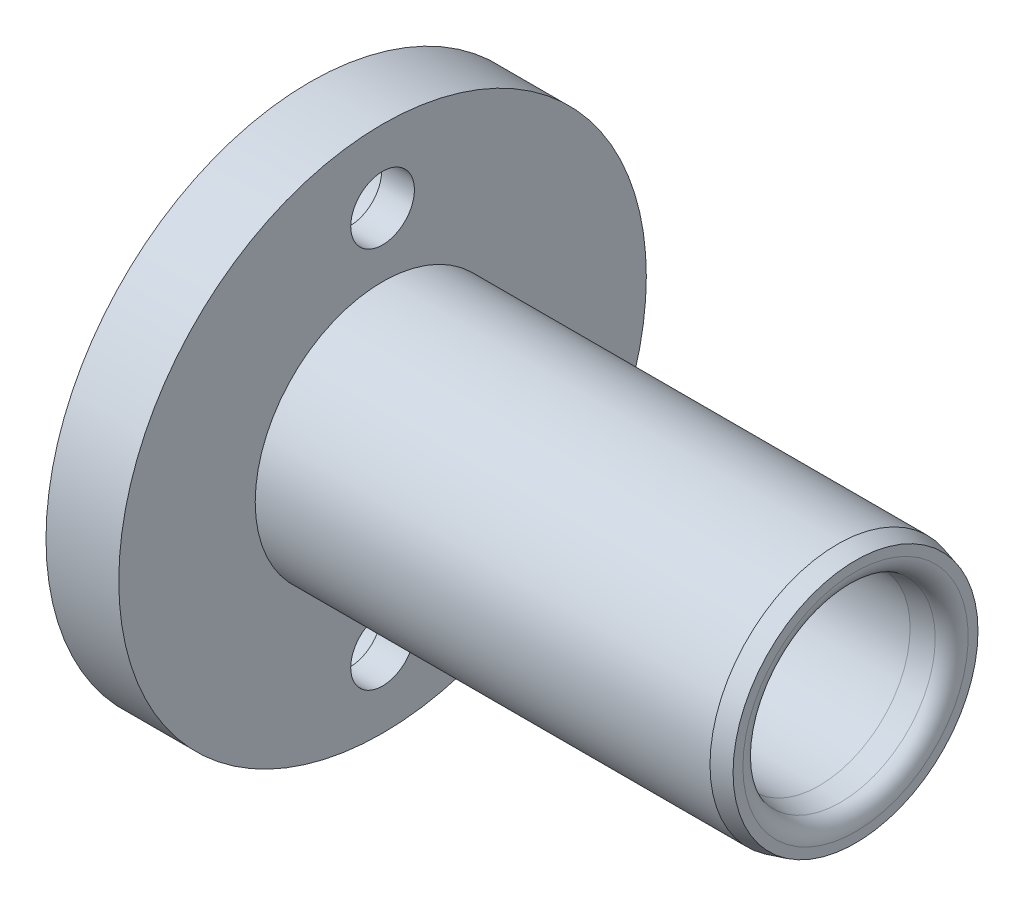
ISO-10303-21;
HEADER;
FILE_DESCRIPTION(('STEP AP214'),'2;1');
FILE_NAME('part.step','',(''),(''),'','','');
FILE_SCHEMA(('AUTOMOTIVE_DESIGN { 1 0 10303 214 1 1 1 1 }'));
ENDSEC;
DATA;
#1=APPLICATION_CONTEXT('core data for automotive mechanical design processes');
#2=APPLICATION_PROTOCOL_DEFINITION('international standard','automotive_design',2000,#1);
#3=PRODUCT_CONTEXT('',#1,'mechanical');
#4=PRODUCT('Part','Part','',(#3));
#5=PRODUCT_RELATED_PRODUCT_CATEGORY('part','',(#4));
#6=PRODUCT_DEFINITION_FORMATION('','',#4);
#7=PRODUCT_DEFINITION_CONTEXT('part definition',#1,'design');
#8=PRODUCT_DEFINITION('design','',#6,#7);
#9=PRODUCT_DEFINITION_SHAPE('','',#8);
#10=(LENGTH_UNIT() NAMED_UNIT(*) SI_UNIT(.MILLI.,.METRE.));
#11=(NAMED_UNIT(*) PLANE_ANGLE_UNIT() SI_UNIT($,.RADIAN.));
#12=(NAMED_UNIT(*) SI_UNIT($,.STERADIAN.) SOLID_ANGLE_UNIT());
#13=UNCERTAINTY_MEASURE_WITH_UNIT(LENGTH_MEASURE(1.E-05),#10,'distance_accuracy_value','');
#14=(GEOMETRIC_REPRESENTATION_CONTEXT(3) GLOBAL_UNCERTAINTY_ASSIGNED_CONTEXT((#13)) GLOBAL_UNIT_ASSIGNED_CONTEXT((#10,
#11,#12)) REPRESENTATION_CONTEXT('',''));
#15=CARTESIAN_POINT('',(0.,0.,0.));
#16=DIRECTION('',(0.,0.,1.));
#17=DIRECTION('',(1.,0.,0.));
#18=AXIS2_PLACEMENT_3D('',#15,#16,#17);
#19=CARTESIAN_POINT('',(26.,5.,0.));
#20=DIRECTION('',(-1.,0.,0.));
#21=DIRECTION('',(0.,0.,1.));
#22=AXIS2_PLACEMENT_3D('',#19,#20,#21);
#23=PLANE('',#22);
#24=CARTESIAN_POINT('',(26.,0.,0.));
#25=DIRECTION('',(-1.,0.,0.));
#26=DIRECTION('',(0.,0.,1.));
#27=AXIS2_PLACEMENT_3D('',#24,#25,#26);
#28=CIRCLE('',#27,6.19175359259422);
#29=CARTESIAN_POINT('',(26.,0.,6.19175359259422));
#30=VERTEX_POINT('',#29);
#31=EDGE_CURVE('E94',#30,#30,#28,.T.);
#32=ORIENTED_EDGE('',*,*,#31,.T.);
#33=EDGE_LOOP('',(#32));
#34=FACE_BOUND('',#33,.T.);
#35=CARTESIAN_POINT('',(26.,0.,0.));
#36=DIRECTION('',(-1.,0.,0.));
#37=DIRECTION('',(0.,0.,1.));
#38=AXIS2_PLACEMENT_3D('',#35,#36,#37);
#39=CIRCLE('',#38,6.73205080756888);
#40=CARTESIAN_POINT('',(26.,0.,6.73205080756888));
#41=VERTEX_POINT('',#40);
#42=EDGE_CURVE('E83',#41,#41,#39,.F.);
#43=ORIENTED_EDGE('',*,*,#42,.T.);
#44=EDGE_LOOP('',(#43));
#45=FACE_BOUND('',#44,.T.);
#46=ADVANCED_FACE('F39',(#34,#45),#23,.F.);
#47=CARTESIAN_POINT('',(0.,0.,0.));
#48=DIRECTION('',(-1.,0.,0.));
#49=DIRECTION('',(0.,0.,1.));
#50=AXIS2_PLACEMENT_3D('',#47,#48,#49);
#51=CYLINDRICAL_SURFACE('',#50,5.);
#52=CARTESIAN_POINT('',(-0.999999999999938,0.,0.));
#53=DIRECTION('',(1.,0.,0.));
#54=DIRECTION('',(0.,0.,-1.));
#55=AXIS2_PLACEMENT_3D('',#52,#53,#54);
#56=CIRCLE('',#55,5.);
#57=CARTESIAN_POINT('',(-0.999999999999938,0.,-5.));
#58=VERTEX_POINT('',#57);
#59=EDGE_CURVE('E91',#58,#58,#56,.F.);
#60=ORIENTED_EDGE('',*,*,#59,.T.);
#61=EDGE_LOOP('',(#60));
#62=FACE_BOUND('',#61,.T.);
#63=CARTESIAN_POINT('',(23.9999999999999,0.,0.));
#64=DIRECTION('',(-1.,0.,0.));
#65=DIRECTION('',(0.,0.,1.));
#66=AXIS2_PLACEMENT_3D('',#63,#64,#65);
#67=CIRCLE('',#66,5.);
#68=CARTESIAN_POINT('',(23.9999999999999,0.,5.));
#69=VERTEX_POINT('',#68);
#70=EDGE_CURVE('E87',#69,#69,#67,.F.);
#71=ORIENTED_EDGE('',*,*,#70,.T.);
#72=EDGE_LOOP('',(#71));
#73=FACE_BOUND('',#72,.T.);
#74=ADVANCED_FACE('F112',(#62,#73),#51,.F.);
#75=CARTESIAN_POINT('',(-4.,5.,0.));
#76=DIRECTION('',(1.,0.,0.));
#77=DIRECTION('',(0.,0.,-1.));
#78=AXIS2_PLACEMENT_3D('',#75,#76,#77);
#79=PLANE('',#78);
#80=CARTESIAN_POINT('',(-4.,10.5,0.));
#81=DIRECTION('',(-1.,0.,0.));
#82=DIRECTION('',(0.,0.,1.));
#83=AXIS2_PLACEMENT_3D('',#80,#81,#82);
#84=CIRCLE('',#83,3.);
#85=CARTESIAN_POINT('',(-4.,10.5,3.));
#86=VERTEX_POINT('',#85);
#87=EDGE_CURVE('E287',#86,#86,#84,.T.);
#88=ORIENTED_EDGE('',*,*,#87,.F.);
#89=EDGE_LOOP('',(#88));
#90=FACE_BOUND('',#89,.T.);
#91=CARTESIAN_POINT('',(-4.,-10.5,0.));
#92=DIRECTION('',(-1.,0.,0.));
#93=DIRECTION('',(0.,0.,1.));
#94=AXIS2_PLACEMENT_3D('',#91,#92,#93);
#95=CIRCLE('',#94,3.);
#96=CARTESIAN_POINT('',(-4.,-10.5,3.));
#97=VERTEX_POINT('',#96);
#98=EDGE_CURVE('E70',#97,#97,#95,.T.);
#99=ORIENTED_EDGE('',*,*,#98,.F.);
#100=EDGE_LOOP('',(#99));
#101=FACE_BOUND('',#100,.T.);
#102=CARTESIAN_POINT('',(-4.,0.,0.));
#103=DIRECTION('',(1.,0.,0.));
#104=DIRECTION('',(0.,0.,-1.));
#105=AXIS2_PLACEMENT_3D('',#102,#103,#104);
#106=CIRCLE('',#105,6.36808057330268);
#107=CARTESIAN_POINT('',(-4.,0.,-6.36808057330268));
#108=VERTEX_POINT('',#107);
#109=EDGE_CURVE('E47',#108,#108,#106,.T.);
#110=ORIENTED_EDGE('',*,*,#109,.T.);
#111=EDGE_LOOP('',(#110));
#112=FACE_BOUND('',#111,.T.);
#113=CARTESIAN_POINT('',(-4.,0.,0.));
#114=DIRECTION('',(-1.,0.,0.));
#115=DIRECTION('',(0.,0.,1.));
#116=AXIS2_PLACEMENT_3D('',#113,#114,#115);
#117=CIRCLE('',#116,14.5);
#118=CARTESIAN_POINT('',(-4.,0.,14.5));
#119=VERTEX_POINT('',#118);
#120=EDGE_CURVE('E76',#119,#119,#117,.T.);
#121=ORIENTED_EDGE('',*,*,#120,.T.);
#122=EDGE_LOOP('',(#121));
#123=FACE_BOUND('',#122,.T.);
#124=ADVANCED_FACE('F136',(#90,#101,#112,#123),#79,.F.);
#125=CARTESIAN_POINT('',(0.,0.,0.));
#126=DIRECTION('',(-1.,0.,0.));
#127=DIRECTION('',(0.,0.,1.));
#128=AXIS2_PLACEMENT_3D('',#125,#126,#127);
#129=CYLINDRICAL_SURFACE('',#128,14.5);
#130=ORIENTED_EDGE('',*,*,#120,.F.);
#131=EDGE_LOOP('',(#130));
#132=FACE_BOUND('',#131,.T.);
#133=CARTESIAN_POINT('',(0.,0.,0.));
#134=DIRECTION('',(-1.,0.,0.));
#135=DIRECTION('',(0.,0.,1.));
#136=AXIS2_PLACEMENT_3D('',#133,#134,#135);
#137=CIRCLE('',#136,14.5);
#138=CARTESIAN_POINT('',(0.,0.,14.5));
#139=VERTEX_POINT('',#138);
#140=EDGE_CURVE('E62',#139,#139,#137,.T.);
#141=ORIENTED_EDGE('',*,*,#140,.T.);
#142=EDGE_LOOP('',(#141));
#143=FACE_BOUND('',#142,.T.);
#144=ADVANCED_FACE('F130',(#132,#143),#129,.T.);
#145=CARTESIAN_POINT('',(0.,7.,0.));
#146=DIRECTION('',(-1.,0.,0.));
#147=DIRECTION('',(0.,0.,1.));
#148=AXIS2_PLACEMENT_3D('',#145,#146,#147);
#149=PLANE('',#148);
#150=CARTESIAN_POINT('',(0.,10.5,0.));
#151=DIRECTION('',(-1.,0.,0.));
#152=DIRECTION('',(0.,0.,1.));
#153=AXIS2_PLACEMENT_3D('',#150,#151,#152);
#154=CIRCLE('',#153,1.75);
#155=CARTESIAN_POINT('',(0.,10.5,1.75));
#156=VERTEX_POINT('',#155);
#157=EDGE_CURVE('E43',#156,#156,#154,.T.);
#158=ORIENTED_EDGE('',*,*,#157,.T.);
#159=EDGE_LOOP('',(#158));
#160=FACE_BOUND('',#159,.T.);
#161=CARTESIAN_POINT('',(0.,-10.5,0.));
#162=DIRECTION('',(-1.,0.,0.));
#163=DIRECTION('',(0.,0.,1.));
#164=AXIS2_PLACEMENT_3D('',#161,#162,#163);
#165=CIRCLE('',#164,1.75);
#166=CARTESIAN_POINT('',(0.,-10.5,1.75));
#167=VERTEX_POINT('',#166);
#168=EDGE_CURVE('E55',#167,#167,#165,.T.);
#169=ORIENTED_EDGE('',*,*,#168,.T.);
#170=EDGE_LOOP('',(#169));
#171=FACE_BOUND('',#170,.T.);
#172=ORIENTED_EDGE('',*,*,#140,.F.);
#173=EDGE_LOOP('',(#172));
#174=FACE_BOUND('',#173,.T.);
#175=CARTESIAN_POINT('',(0.,0.,0.));
#176=DIRECTION('',(-1.,0.,0.));
#177=DIRECTION('',(0.,0.,1.));
#178=AXIS2_PLACEMENT_3D('',#175,#176,#177);
#179=CIRCLE('',#178,7.);
#180=CARTESIAN_POINT('',(0.,0.,7.));
#181=VERTEX_POINT('',#180);
#182=EDGE_CURVE('E57',#181,#181,#179,.T.);
#183=ORIENTED_EDGE('',*,*,#182,.T.);
#184=EDGE_LOOP('',(#183));
#185=FACE_BOUND('',#184,.T.);
#186=ADVANCED_FACE('F125',(#160,#171,#174,#185),#149,.F.);
#187=CARTESIAN_POINT('',(0.,0.,0.));
#188=DIRECTION('',(-1.,0.,0.));
#189=DIRECTION('',(0.,0.,1.));
#190=AXIS2_PLACEMENT_3D('',#187,#188,#189);
#191=CYLINDRICAL_SURFACE('',#190,7.);
#192=CARTESIAN_POINT('',(25.,0.,0.));
#193=DIRECTION('',(-1.,0.,0.));
#194=DIRECTION('',(0.,0.,1.));
#195=AXIS2_PLACEMENT_3D('',#192,#193,#194);
#196=CIRCLE('',#195,7.);
#197=CARTESIAN_POINT('',(25.,0.,7.));
#198=VERTEX_POINT('',#197);
#199=EDGE_CURVE('E79',#198,#198,#196,.T.);
#200=ORIENTED_EDGE('',*,*,#199,.T.);
#201=EDGE_LOOP('',(#200));
#202=FACE_BOUND('',#201,.T.);
#203=ORIENTED_EDGE('',*,*,#182,.F.);
#204=EDGE_LOOP('',(#203));
#205=FACE_BOUND('',#204,.T.);
#206=ADVANCED_FACE('F119',(#202,#205),#191,.T.);
#207=CARTESIAN_POINT('',(25.,0.,0.));
#208=DIRECTION('',(-1.,0.,0.));
#209=DIRECTION('',(0.,0.,1.));
#210=AXIS2_PLACEMENT_3D('',#207,#208,#209);
#211=CONICAL_SURFACE('',#210,7.,0.261799387799144);
#212=ORIENTED_EDGE('',*,*,#42,.F.);
#213=EDGE_LOOP('',(#212));
#214=FACE_BOUND('',#213,.T.);
#215=ORIENTED_EDGE('',*,*,#199,.F.);
#216=EDGE_LOOP('',(#215));
#217=FACE_BOUND('',#216,.T.);
#218=ADVANCED_FACE('F116',(#214,#217),#211,.T.);
#219=CARTESIAN_POINT('',(26.,0.,0.));
#220=DIRECTION('',(1.,0.,0.));
#221=DIRECTION('',(0.,0.,-1.));
#222=AXIS2_PLACEMENT_3D('',#219,#220,#221);
#223=CONICAL_SURFACE('',#222,5.35265396141693,0.17453292519943);
#224=CARTESIAN_POINT('',(25.1736481776669,0.,0.));
#225=DIRECTION('',(1.,0.,0.));
#226=DIRECTION('',(0.,0.,-1.));
#227=AXIS2_PLACEMENT_3D('',#224,#225,#226);
#228=CIRCLE('',#227,5.20694583958201);
#229=CARTESIAN_POINT('',(25.1736481776669,0.,-5.20694583958201));
#230=VERTEX_POINT('',#229);
#231=EDGE_CURVE('E52',#230,#230,#228,.T.);
#232=ORIENTED_EDGE('',*,*,#231,.T.);
#233=EDGE_LOOP('',(#232));
#234=FACE_BOUND('',#233,.T.);
#235=ORIENTED_EDGE('',*,*,#70,.F.);
#236=EDGE_LOOP('',(#235));
#237=FACE_BOUND('',#236,.T.);
#238=ADVANCED_FACE('F101',(#234,#237),#223,.F.);
#239=CARTESIAN_POINT('',(-0.999999999999938,0.,0.));
#240=DIRECTION('',(-1.,0.,0.));
#241=DIRECTION('',(0.,0.,1.));
#242=AXIS2_PLACEMENT_3D('',#239,#240,#241);
#243=CONICAL_SURFACE('',#242,5.,0.17453292519943);
#244=CARTESIAN_POINT('',(-3.17364817766693,0.,0.));
#245=DIRECTION('',(-1.,0.,0.));
#246=DIRECTION('',(0.,0.,1.));
#247=AXIS2_PLACEMENT_3D('',#244,#245,#246);
#248=CIRCLE('',#247,5.38327282029047);
#249=CARTESIAN_POINT('',(-3.17364817766693,0.,5.38327282029047));
#250=VERTEX_POINT('',#249);
#251=EDGE_CURVE('E10',#250,#250,#248,.T.);
#252=ORIENTED_EDGE('',*,*,#251,.T.);
#253=EDGE_LOOP('',(#252));
#254=FACE_BOUND('',#253,.T.);
#255=ORIENTED_EDGE('',*,*,#59,.F.);
#256=EDGE_LOOP('',(#255));
#257=FACE_BOUND('',#256,.T.);
#258=ADVANCED_FACE('F107',(#254,#257),#243,.F.);
#259=CARTESIAN_POINT('',(25.,0.,0.));
#260=DIRECTION('',(-1.,0.,0.));
#261=DIRECTION('',(0.,0.,1.));
#262=AXIS2_PLACEMENT_3D('',#259,#260,#261);
#263=TOROIDAL_SURFACE('',#262,6.19175359259422,1.);
#264=ORIENTED_EDGE('',*,*,#231,.F.);
#265=EDGE_LOOP('',(#264));
#266=FACE_BOUND('',#265,.T.);
#267=ORIENTED_EDGE('',*,*,#31,.F.);
#268=EDGE_LOOP('',(#267));
#269=FACE_BOUND('',#268,.T.);
#270=ADVANCED_FACE('F104',(#266,#269),#263,.T.);
#271=CARTESIAN_POINT('',(-3.,0.,0.));
#272=DIRECTION('',(1.,0.,0.));
#273=DIRECTION('',(0.,0.,-1.));
#274=AXIS2_PLACEMENT_3D('',#271,#272,#273);
#275=TOROIDAL_SURFACE('',#274,6.36808057330268,1.);
#276=ORIENTED_EDGE('',*,*,#251,.F.);
#277=EDGE_LOOP('',(#276));
#278=FACE_BOUND('',#277,.T.);
#279=ORIENTED_EDGE('',*,*,#109,.F.);
#280=EDGE_LOOP('',(#279));
#281=FACE_BOUND('',#280,.T.);
#282=ADVANCED_FACE('F41',(#278,#281),#275,.T.);
#283=CARTESIAN_POINT('',(-4.,-10.5,0.));
#284=DIRECTION('',(-1.,0.,0.));
#285=DIRECTION('',(0.,0.,1.));
#286=AXIS2_PLACEMENT_3D('',#283,#284,#285);
#287=CYLINDRICAL_SURFACE('',#286,1.75);
#288=CARTESIAN_POINT('',(-1.8,-10.5,0.));
#289=DIRECTION('',(-1.,0.,0.));
#290=DIRECTION('',(0.,0.,1.));
#291=AXIS2_PLACEMENT_3D('',#288,#289,#290);
#292=CIRCLE('',#291,1.75);
#293=CARTESIAN_POINT('',(-1.8,-10.5,1.75));
#294=VERTEX_POINT('',#293);
#295=EDGE_CURVE('E58',#294,#294,#292,.T.);
#296=ORIENTED_EDGE('',*,*,#295,.T.);
#297=EDGE_LOOP('',(#296));
#298=FACE_BOUND('',#297,.T.);
#299=ORIENTED_EDGE('',*,*,#168,.F.);
#300=EDGE_LOOP('',(#299));
#301=FACE_BOUND('',#300,.T.);
#302=ADVANCED_FACE('F169',(#298,#301),#287,.F.);
#303=CARTESIAN_POINT('',(-1.8,-8.75,0.));
#304=DIRECTION('',(1.,0.,0.));
#305=DIRECTION('',(0.,0.,-1.));
#306=AXIS2_PLACEMENT_3D('',#303,#304,#305);
#307=PLANE('',#306);
#308=ORIENTED_EDGE('',*,*,#295,.F.);
#309=EDGE_LOOP('',(#308));
#310=FACE_BOUND('',#309,.T.);
#311=CARTESIAN_POINT('',(-1.8,-10.5,0.));
#312=DIRECTION('',(-1.,0.,0.));
#313=DIRECTION('',(0.,0.,1.));
#314=AXIS2_PLACEMENT_3D('',#311,#312,#313);
#315=CIRCLE('',#314,3.);
#316=CARTESIAN_POINT('',(-1.8,-10.5,3.));
#317=VERTEX_POINT('',#316);
#318=EDGE_CURVE('E65',#317,#317,#315,.T.);
#319=ORIENTED_EDGE('',*,*,#318,.T.);
#320=EDGE_LOOP('',(#319));
#321=FACE_BOUND('',#320,.T.);
#322=ADVANCED_FACE('F177',(#310,#321),#307,.F.);
#323=CARTESIAN_POINT('',(-4.,-10.5,0.));
#324=DIRECTION('',(-1.,0.,0.));
#325=DIRECTION('',(0.,0.,1.));
#326=AXIS2_PLACEMENT_3D('',#323,#324,#325);
#327=CYLINDRICAL_SURFACE('',#326,3.);
#328=ORIENTED_EDGE('',*,*,#318,.F.);
#329=EDGE_LOOP('',(#328));
#330=FACE_BOUND('',#329,.T.);
#331=ORIENTED_EDGE('',*,*,#98,.T.);
#332=EDGE_LOOP('',(#331));
#333=FACE_BOUND('',#332,.T.);
#334=ADVANCED_FACE('F183',(#330,#333),#327,.F.);
#335=CARTESIAN_POINT('',(-4.,10.5,0.));
#336=DIRECTION('',(-1.,0.,0.));
#337=DIRECTION('',(0.,0.,1.));
#338=AXIS2_PLACEMENT_3D('',#335,#336,#337);
#339=CYLINDRICAL_SURFACE('',#338,1.75);
#340=CARTESIAN_POINT('',(-1.8,10.5,0.));
#341=DIRECTION('',(-1.,0.,0.));
#342=DIRECTION('',(0.,0.,1.));
#343=AXIS2_PLACEMENT_3D('',#340,#341,#342);
#344=CIRCLE('',#343,1.75);
#345=CARTESIAN_POINT('',(-1.8,10.5,1.75));
#346=VERTEX_POINT('',#345);
#347=EDGE_CURVE('E289',#346,#346,#344,.T.);
#348=ORIENTED_EDGE('',*,*,#347,.T.);
#349=EDGE_LOOP('',(#348));
#350=FACE_BOUND('',#349,.T.);
#351=ORIENTED_EDGE('',*,*,#157,.F.);
#352=EDGE_LOOP('',(#351));
#353=FACE_BOUND('',#352,.T.);
#354=ADVANCED_FACE('F191',(#350,#353),#339,.F.);
#355=CARTESIAN_POINT('',(-1.8,12.25,0.));
#356=DIRECTION('',(1.,0.,0.));
#357=DIRECTION('',(0.,0.,-1.));
#358=AXIS2_PLACEMENT_3D('',#355,#356,#357);
#359=PLANE('',#358);
#360=ORIENTED_EDGE('',*,*,#347,.F.);
#361=EDGE_LOOP('',(#360));
#362=FACE_BOUND('',#361,.T.);
#363=CARTESIAN_POINT('',(-1.8,10.5,0.));
#364=DIRECTION('',(-1.,0.,0.));
#365=DIRECTION('',(0.,0.,1.));
#366=AXIS2_PLACEMENT_3D('',#363,#364,#365);
#367=CIRCLE('',#366,3.);
#368=CARTESIAN_POINT('',(-1.8,10.5,3.));
#369=VERTEX_POINT('',#368);
#370=EDGE_CURVE('E284',#369,#369,#367,.T.);
#371=ORIENTED_EDGE('',*,*,#370,.T.);
#372=EDGE_LOOP('',(#371));
#373=FACE_BOUND('',#372,.T.);
#374=ADVANCED_FACE('F199',(#362,#373),#359,.F.);
#375=CARTESIAN_POINT('',(-4.,10.5,0.));
#376=DIRECTION('',(-1.,0.,0.));
#377=DIRECTION('',(0.,0.,1.));
#378=AXIS2_PLACEMENT_3D('',#375,#376,#377);
#379=CYLINDRICAL_SURFACE('',#378,3.);
#380=ORIENTED_EDGE('',*,*,#370,.F.);
#381=EDGE_LOOP('',(#380));
#382=FACE_BOUND('',#381,.T.);
#383=ORIENTED_EDGE('',*,*,#87,.T.);
#384=EDGE_LOOP('',(#383));
#385=FACE_BOUND('',#384,.T.);
#386=ADVANCED_FACE('F207',(#382,#385),#379,.F.);
#387=CLOSED_SHELL('',(#46,#74,#124,#144,#186,#206,#218,#238,#258,#270,#282,#302,#322,#334,#354,
#374,#386));
#388=MANIFOLD_SOLID_BREP('B2',#387);
#389=ADVANCED_BREP_SHAPE_REPRESENTATION('',(#18,#388),#14);
#390=SHAPE_DEFINITION_REPRESENTATION(#9,#389);
ENDSEC;
END-ISO-10303-21;
